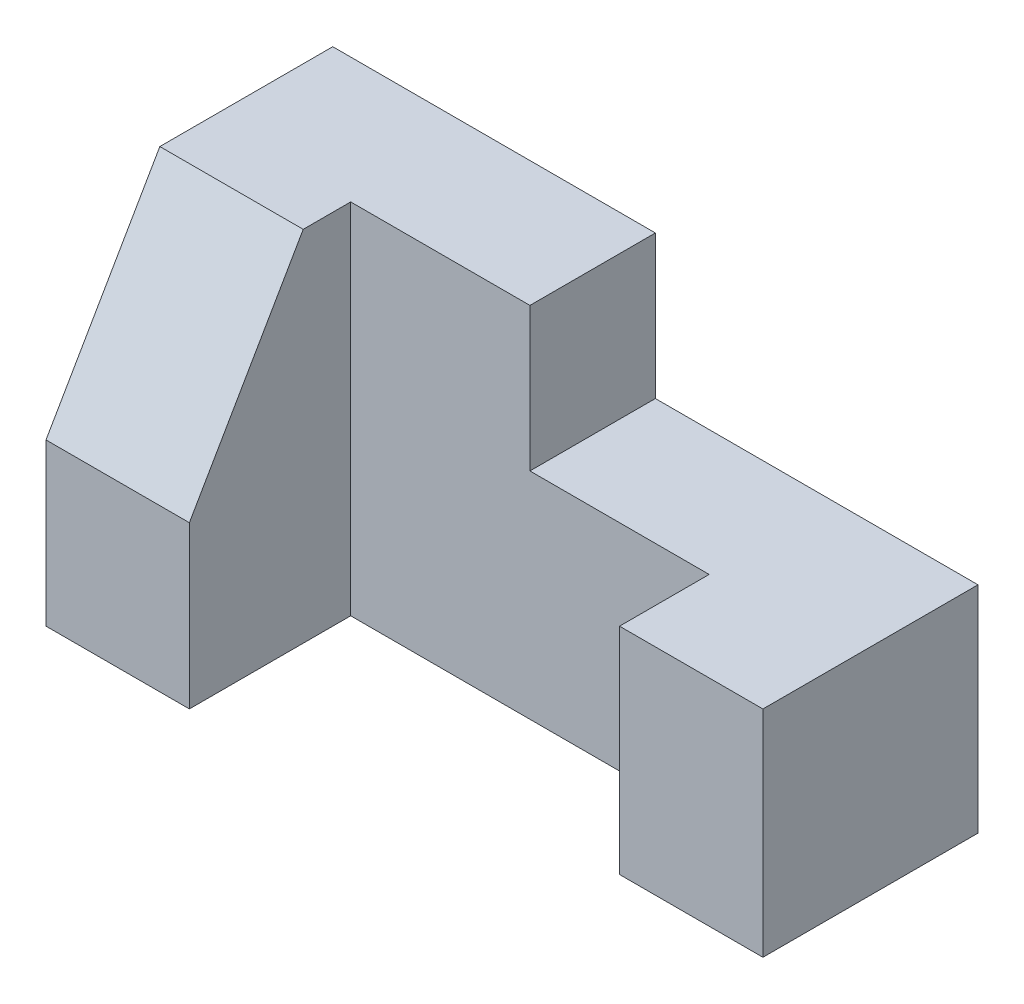
ISO-10303-21;
HEADER;
FILE_DESCRIPTION(('STEP AP214'),'2;1');
FILE_NAME('part.step','',(''),(''),'','','');
FILE_SCHEMA(('AUTOMOTIVE_DESIGN { 1 0 10303 214 1 1 1 1 }'));
ENDSEC;
DATA;
#1=APPLICATION_CONTEXT('core data for automotive mechanical design processes');
#2=APPLICATION_PROTOCOL_DEFINITION('international standard','automotive_design',2000,#1);
#3=PRODUCT_CONTEXT('',#1,'mechanical');
#4=PRODUCT('Part','Part','',(#3));
#5=PRODUCT_RELATED_PRODUCT_CATEGORY('part','',(#4));
#6=PRODUCT_DEFINITION_FORMATION('','',#4);
#7=PRODUCT_DEFINITION_CONTEXT('part definition',#1,'design');
#8=PRODUCT_DEFINITION('design','',#6,#7);
#9=PRODUCT_DEFINITION_SHAPE('','',#8);
#10=(LENGTH_UNIT() NAMED_UNIT(*) SI_UNIT(.MILLI.,.METRE.));
#11=(NAMED_UNIT(*) PLANE_ANGLE_UNIT() SI_UNIT($,.RADIAN.));
#12=(NAMED_UNIT(*) SI_UNIT($,.STERADIAN.) SOLID_ANGLE_UNIT());
#13=UNCERTAINTY_MEASURE_WITH_UNIT(LENGTH_MEASURE(1.E-05),#10,'distance_accuracy_value','');
#14=(GEOMETRIC_REPRESENTATION_CONTEXT(3) GLOBAL_UNCERTAINTY_ASSIGNED_CONTEXT((#13)) GLOBAL_UNIT_ASSIGNED_CONTEXT((#10,
#11,#12)) REPRESENTATION_CONTEXT('',''));
#15=CARTESIAN_POINT('',(0.,0.,0.));
#16=DIRECTION('',(0.,0.,1.));
#17=DIRECTION('',(1.,0.,0.));
#18=AXIS2_PLACEMENT_3D('',#15,#16,#17);
#19=CARTESIAN_POINT('',(0.,38.1,22.225));
#20=DIRECTION('',(0.,-1.,0.));
#21=DIRECTION('',(1.,0.,0.));
#22=AXIS2_PLACEMENT_3D('',#19,#20,#21);
#23=PLANE('',#22);
#24=DIRECTION('',(-1.,0.,0.));
#25=VECTOR('',#24,1.);
#26=CARTESIAN_POINT('',(0.,38.1,0.));
#27=LINE('',#26,#25);
#28=CARTESIAN_POINT('',(114.3,38.1,0.));
#29=VERTEX_POINT('',#28);
#30=CARTESIAN_POINT('',(57.15,38.1,0.));
#31=VERTEX_POINT('',#30);
#32=EDGE_CURVE('E198',#29,#31,#27,.T.);
#33=ORIENTED_EDGE('',*,*,#32,.T.);
#34=DIRECTION('',(0.,0.,-1.));
#35=VECTOR('',#34,1.);
#36=CARTESIAN_POINT('',(57.15,38.1,22.225));
#37=LINE('',#36,#35);
#38=CARTESIAN_POINT('',(57.15,38.1,22.225));
#39=VERTEX_POINT('',#38);
#40=EDGE_CURVE('E11',#39,#31,#37,.T.);
#41=ORIENTED_EDGE('',*,*,#40,.F.);
#42=DIRECTION('',(-1.,0.,0.));
#43=VECTOR('',#42,1.);
#44=CARTESIAN_POINT('',(0.,38.1,22.225));
#45=LINE('',#44,#43);
#46=CARTESIAN_POINT('',(88.9,38.1,22.225));
#47=VERTEX_POINT('',#46);
#48=EDGE_CURVE('E93',#47,#39,#45,.T.);
#49=ORIENTED_EDGE('',*,*,#48,.F.);
#50=DIRECTION('',(0.,0.,-1.));
#51=VECTOR('',#50,1.);
#52=CARTESIAN_POINT('',(88.9,38.1,38.1));
#53=LINE('',#52,#51);
#54=CARTESIAN_POINT('',(88.9,38.1,38.1));
#55=VERTEX_POINT('',#54);
#56=EDGE_CURVE('E194',#55,#47,#53,.T.);
#57=ORIENTED_EDGE('',*,*,#56,.F.);
#58=DIRECTION('',(-1.,0.,0.));
#59=VECTOR('',#58,1.);
#60=CARTESIAN_POINT('',(0.,38.1,38.1));
#61=LINE('',#60,#59);
#62=CARTESIAN_POINT('',(114.3,38.1,38.1));
#63=VERTEX_POINT('',#62);
#64=EDGE_CURVE('E164',#63,#55,#61,.T.);
#65=ORIENTED_EDGE('',*,*,#64,.F.);
#66=DIRECTION('',(0.,0.,-1.));
#67=VECTOR('',#66,1.);
#68=CARTESIAN_POINT('',(114.3,38.1,38.1));
#69=LINE('',#68,#67);
#70=EDGE_CURVE('E181',#63,#29,#69,.T.);
#71=ORIENTED_EDGE('',*,*,#70,.T.);
#72=EDGE_LOOP('',(#33,#41,#49,#57,#65,#71));
#73=FACE_BOUND('',#72,.T.);
#74=ADVANCED_FACE('F45',(#73),#23,.F.);
#75=CARTESIAN_POINT('',(57.15,0.,22.225));
#76=DIRECTION('',(-1.,0.,0.));
#77=DIRECTION('',(0.,0.,1.));
#78=AXIS2_PLACEMENT_3D('',#75,#76,#77);
#79=PLANE('',#78);
#80=DIRECTION('',(0.,1.,0.));
#81=VECTOR('',#80,1.);
#82=CARTESIAN_POINT('',(57.15,0.,0.));
#83=LINE('',#82,#81);
#84=CARTESIAN_POINT('',(57.15,63.5,0.));
#85=VERTEX_POINT('',#84);
#86=EDGE_CURVE('E85',#31,#85,#83,.T.);
#87=ORIENTED_EDGE('',*,*,#86,.T.);
#88=DIRECTION('',(0.,0.,-1.));
#89=VECTOR('',#88,1.);
#90=CARTESIAN_POINT('',(57.15,63.5,22.225));
#91=LINE('',#90,#89);
#92=CARTESIAN_POINT('',(57.15,63.5,22.225));
#93=VERTEX_POINT('',#92);
#94=EDGE_CURVE('E53',#93,#85,#91,.T.);
#95=ORIENTED_EDGE('',*,*,#94,.F.);
#96=DIRECTION('',(0.,1.,0.));
#97=VECTOR('',#96,1.);
#98=CARTESIAN_POINT('',(57.15,0.,22.225));
#99=LINE('',#98,#97);
#100=EDGE_CURVE('E206',#39,#93,#99,.T.);
#101=ORIENTED_EDGE('',*,*,#100,.F.);
#102=ORIENTED_EDGE('',*,*,#40,.T.);
#103=EDGE_LOOP('',(#87,#95,#101,#102));
#104=FACE_BOUND('',#103,.T.);
#105=ADVANCED_FACE('F278',(#104),#79,.F.);
#106=CARTESIAN_POINT('',(0.,63.5,22.225));
#107=DIRECTION('',(0.,-1.,0.));
#108=DIRECTION('',(1.,0.,0.));
#109=AXIS2_PLACEMENT_3D('',#106,#107,#108);
#110=PLANE('',#109);
#111=DIRECTION('',(0.,0.,-1.));
#112=VECTOR('',#111,1.);
#113=CARTESIAN_POINT('',(0.,63.5,50.8));
#114=LINE('',#113,#112);
#115=CARTESIAN_POINT('',(0.,63.5,30.6360418485526));
#116=VERTEX_POINT('',#115);
#117=CARTESIAN_POINT('',(0.,63.5,0.));
#118=VERTEX_POINT('',#117);
#119=EDGE_CURVE('E152',#116,#118,#114,.T.);
#120=ORIENTED_EDGE('',*,*,#119,.F.);
#121=DIRECTION('',(-1.,0.,0.));
#122=VECTOR('',#121,1.);
#123=CARTESIAN_POINT('',(25.4,63.5,30.6360418485526));
#124=LINE('',#123,#122);
#125=CARTESIAN_POINT('',(25.4,63.5,30.6360418485526));
#126=VERTEX_POINT('',#125);
#127=EDGE_CURVE('E140',#126,#116,#124,.T.);
#128=ORIENTED_EDGE('',*,*,#127,.F.);
#129=DIRECTION('',(0.,0.,-1.));
#130=VECTOR('',#129,1.);
#131=CARTESIAN_POINT('',(25.4,63.5,50.8));
#132=LINE('',#131,#130);
#133=CARTESIAN_POINT('',(25.4,63.5,22.225));
#134=VERTEX_POINT('',#133);
#135=EDGE_CURVE('E150',#126,#134,#132,.T.);
#136=ORIENTED_EDGE('',*,*,#135,.T.);
#137=DIRECTION('',(-1.,0.,0.));
#138=VECTOR('',#137,1.);
#139=CARTESIAN_POINT('',(0.,63.5,22.225));
#140=LINE('',#139,#138);
#141=EDGE_CURVE('E209',#93,#134,#140,.T.);
#142=ORIENTED_EDGE('',*,*,#141,.F.);
#143=ORIENTED_EDGE('',*,*,#94,.T.);
#144=DIRECTION('',(-1.,0.,0.));
#145=VECTOR('',#144,1.);
#146=CARTESIAN_POINT('',(0.,63.5,0.));
#147=LINE('',#146,#145);
#148=EDGE_CURVE('E221',#85,#118,#147,.T.);
#149=ORIENTED_EDGE('',*,*,#148,.T.);
#150=EDGE_LOOP('',(#120,#128,#136,#142,#143,#149));
#151=FACE_BOUND('',#150,.T.);
#152=ADVANCED_FACE('F148',(#151),#110,.F.);
#153=CARTESIAN_POINT('',(0.,0.,22.225));
#154=DIRECTION('',(0.,1.,0.));
#155=DIRECTION('',(0.,0.,1.));
#156=AXIS2_PLACEMENT_3D('',#153,#154,#155);
#157=PLANE('',#156);
#158=DIRECTION('',(1.,0.,0.));
#159=VECTOR('',#158,1.);
#160=CARTESIAN_POINT('',(0.,0.,0.));
#161=LINE('',#160,#159);
#162=CARTESIAN_POINT('',(0.,0.,0.));
#163=VERTEX_POINT('',#162);
#164=CARTESIAN_POINT('',(114.3,0.,0.));
#165=VERTEX_POINT('',#164);
#166=EDGE_CURVE('E203',#163,#165,#161,.T.);
#167=ORIENTED_EDGE('',*,*,#166,.T.);
#168=DIRECTION('',(0.,0.,-1.));
#169=VECTOR('',#168,1.);
#170=CARTESIAN_POINT('',(114.3,0.,38.1));
#171=LINE('',#170,#169);
#172=CARTESIAN_POINT('',(114.3,0.,38.1));
#173=VERTEX_POINT('',#172);
#174=EDGE_CURVE('E186',#173,#165,#171,.T.);
#175=ORIENTED_EDGE('',*,*,#174,.F.);
#176=DIRECTION('',(1.,0.,0.));
#177=VECTOR('',#176,1.);
#178=CARTESIAN_POINT('',(0.,0.,38.1));
#179=LINE('',#178,#177);
#180=CARTESIAN_POINT('',(88.9,0.,38.1));
#181=VERTEX_POINT('',#180);
#182=EDGE_CURVE('E176',#181,#173,#179,.T.);
#183=ORIENTED_EDGE('',*,*,#182,.F.);
#184=DIRECTION('',(0.,0.,-1.));
#185=VECTOR('',#184,1.);
#186=CARTESIAN_POINT('',(88.9,0.,38.1));
#187=LINE('',#186,#185);
#188=CARTESIAN_POINT('',(88.9,0.,22.225));
#189=VERTEX_POINT('',#188);
#190=EDGE_CURVE('E190',#181,#189,#187,.T.);
#191=ORIENTED_EDGE('',*,*,#190,.T.);
#192=DIRECTION('',(1.,0.,0.));
#193=VECTOR('',#192,1.);
#194=CARTESIAN_POINT('',(0.,0.,22.225));
#195=LINE('',#194,#193);
#196=CARTESIAN_POINT('',(25.4,0.,22.225));
#197=VERTEX_POINT('',#196);
#198=EDGE_CURVE('E214',#197,#189,#195,.T.);
#199=ORIENTED_EDGE('',*,*,#198,.F.);
#200=DIRECTION('',(0.,0.,-1.));
#201=VECTOR('',#200,1.);
#202=CARTESIAN_POINT('',(25.4,0.,50.8));
#203=LINE('',#202,#201);
#204=CARTESIAN_POINT('',(25.4,0.,50.8));
#205=VERTEX_POINT('',#204);
#206=EDGE_CURVE('E69',#205,#197,#203,.T.);
#207=ORIENTED_EDGE('',*,*,#206,.F.);
#208=DIRECTION('',(1.,0.,0.));
#209=VECTOR('',#208,1.);
#210=CARTESIAN_POINT('',(0.,0.,50.8));
#211=LINE('',#210,#209);
#212=CARTESIAN_POINT('',(0.,0.,50.8));
#213=VERTEX_POINT('',#212);
#214=EDGE_CURVE('E247',#213,#205,#211,.T.);
#215=ORIENTED_EDGE('',*,*,#214,.F.);
#216=DIRECTION('',(0.,0.,-1.));
#217=VECTOR('',#216,1.);
#218=CARTESIAN_POINT('',(0.,0.,50.8));
#219=LINE('',#218,#217);
#220=EDGE_CURVE('E166',#213,#163,#219,.T.);
#221=ORIENTED_EDGE('',*,*,#220,.T.);
#222=EDGE_LOOP('',(#167,#175,#183,#191,#199,#207,#215,#221));
#223=FACE_BOUND('',#222,.T.);
#224=ADVANCED_FACE('F253',(#223),#157,.F.);
#225=CARTESIAN_POINT('',(0.,0.,22.225));
#226=DIRECTION('',(0.,0.,1.));
#227=DIRECTION('',(1.,0.,0.));
#228=AXIS2_PLACEMENT_3D('',#225,#226,#227);
#229=PLANE('',#228);
#230=DIRECTION('',(0.,-1.,0.));
#231=VECTOR('',#230,1.);
#232=CARTESIAN_POINT('',(88.9,0.,22.225));
#233=LINE('',#232,#231);
#234=EDGE_CURVE('E199',#47,#189,#233,.T.);
#235=ORIENTED_EDGE('',*,*,#234,.F.);
#236=ORIENTED_EDGE('',*,*,#48,.T.);
#237=ORIENTED_EDGE('',*,*,#100,.T.);
#238=ORIENTED_EDGE('',*,*,#141,.T.);
#239=DIRECTION('',(0.,-1.,0.));
#240=VECTOR('',#239,1.);
#241=CARTESIAN_POINT('',(25.4,0.,22.225));
#242=LINE('',#241,#240);
#243=EDGE_CURVE('E156',#134,#197,#242,.T.);
#244=ORIENTED_EDGE('',*,*,#243,.T.);
#245=ORIENTED_EDGE('',*,*,#198,.T.);
#246=EDGE_LOOP('',(#235,#236,#237,#238,#244,#245));
#247=FACE_BOUND('',#246,.T.);
#248=ADVANCED_FACE('F268',(#247),#229,.T.);
#249=CARTESIAN_POINT('',(0.,0.,0.));
#250=DIRECTION('',(0.,0.,1.));
#251=DIRECTION('',(1.,0.,0.));
#252=AXIS2_PLACEMENT_3D('',#249,#250,#251);
#253=PLANE('',#252);
#254=ORIENTED_EDGE('',*,*,#32,.F.);
#255=DIRECTION('',(0.,1.,0.));
#256=VECTOR('',#255,1.);
#257=CARTESIAN_POINT('',(114.3,0.,0.));
#258=LINE('',#257,#256);
#259=EDGE_CURVE('E159',#165,#29,#258,.T.);
#260=ORIENTED_EDGE('',*,*,#259,.F.);
#261=ORIENTED_EDGE('',*,*,#166,.F.);
#262=DIRECTION('',(0.,-1.,0.));
#263=VECTOR('',#262,1.);
#264=CARTESIAN_POINT('',(0.,0.,0.));
#265=LINE('',#264,#263);
#266=EDGE_CURVE('E232',#118,#163,#265,.T.);
#267=ORIENTED_EDGE('',*,*,#266,.F.);
#268=ORIENTED_EDGE('',*,*,#148,.F.);
#269=ORIENTED_EDGE('',*,*,#86,.F.);
#270=EDGE_LOOP('',(#254,#260,#261,#267,#268,#269));
#271=FACE_BOUND('',#270,.T.);
#272=ADVANCED_FACE('F230',(#271),#253,.F.);
#273=CARTESIAN_POINT('',(88.9,0.,38.1));
#274=DIRECTION('',(1.,0.,0.));
#275=DIRECTION('',(0.,0.,-1.));
#276=AXIS2_PLACEMENT_3D('',#273,#274,#275);
#277=PLANE('',#276);
#278=ORIENTED_EDGE('',*,*,#56,.T.);
#279=ORIENTED_EDGE('',*,*,#234,.T.);
#280=ORIENTED_EDGE('',*,*,#190,.F.);
#281=DIRECTION('',(0.,-1.,0.));
#282=VECTOR('',#281,1.);
#283=CARTESIAN_POINT('',(88.9,0.,38.1));
#284=LINE('',#283,#282);
#285=EDGE_CURVE('E173',#55,#181,#284,.T.);
#286=ORIENTED_EDGE('',*,*,#285,.F.);
#287=EDGE_LOOP('',(#278,#279,#280,#286));
#288=FACE_BOUND('',#287,.T.);
#289=ADVANCED_FACE('F270',(#288),#277,.F.);
#290=CARTESIAN_POINT('',(114.3,0.,38.1));
#291=DIRECTION('',(-1.,0.,0.));
#292=DIRECTION('',(0.,-1.,0.));
#293=AXIS2_PLACEMENT_3D('',#290,#291,#292);
#294=PLANE('',#293);
#295=ORIENTED_EDGE('',*,*,#259,.T.);
#296=ORIENTED_EDGE('',*,*,#70,.F.);
#297=DIRECTION('',(0.,1.,0.));
#298=VECTOR('',#297,1.);
#299=CARTESIAN_POINT('',(114.3,0.,38.1));
#300=LINE('',#299,#298);
#301=EDGE_CURVE('E179',#173,#63,#300,.T.);
#302=ORIENTED_EDGE('',*,*,#301,.F.);
#303=ORIENTED_EDGE('',*,*,#174,.T.);
#304=EDGE_LOOP('',(#295,#296,#302,#303));
#305=FACE_BOUND('',#304,.T.);
#306=ADVANCED_FACE('F277',(#305),#294,.F.);
#307=CARTESIAN_POINT('',(0.,0.,38.1));
#308=DIRECTION('',(0.,0.,1.));
#309=DIRECTION('',(1.,0.,0.));
#310=AXIS2_PLACEMENT_3D('',#307,#308,#309);
#311=PLANE('',#310);
#312=ORIENTED_EDGE('',*,*,#64,.T.);
#313=ORIENTED_EDGE('',*,*,#285,.T.);
#314=ORIENTED_EDGE('',*,*,#182,.T.);
#315=ORIENTED_EDGE('',*,*,#301,.T.);
#316=EDGE_LOOP('',(#312,#313,#314,#315));
#317=FACE_BOUND('',#316,.T.);
#318=ADVANCED_FACE('F274',(#317),#311,.T.);
#319=CARTESIAN_POINT('',(25.4,0.,50.8));
#320=DIRECTION('',(1.,0.,0.));
#321=DIRECTION('',(0.,1.,0.));
#322=AXIS2_PLACEMENT_3D('',#319,#320,#321);
#323=PLANE('',#322);
#324=DIRECTION('',(0.,-0.866025403784442,0.499999999999995));
#325=VECTOR('',#324,1.);
#326=CARTESIAN_POINT('',(25.4,28.575,50.8));
#327=LINE('',#326,#325);
#328=CARTESIAN_POINT('',(25.4,28.575,50.8));
#329=VERTEX_POINT('',#328);
#330=EDGE_CURVE('E137',#126,#329,#327,.T.);
#331=ORIENTED_EDGE('',*,*,#330,.T.);
#332=DIRECTION('',(0.,-1.,0.));
#333=VECTOR('',#332,1.);
#334=CARTESIAN_POINT('',(25.4,0.,50.8));
#335=LINE('',#334,#333);
#336=EDGE_CURVE('E238',#329,#205,#335,.T.);
#337=ORIENTED_EDGE('',*,*,#336,.T.);
#338=ORIENTED_EDGE('',*,*,#206,.T.);
#339=ORIENTED_EDGE('',*,*,#243,.F.);
#340=ORIENTED_EDGE('',*,*,#135,.F.);
#341=EDGE_LOOP('',(#331,#337,#338,#339,#340));
#342=FACE_BOUND('',#341,.T.);
#343=ADVANCED_FACE('F155',(#342),#323,.T.);
#344=CARTESIAN_POINT('',(0.,0.,50.8));
#345=DIRECTION('',(1.,0.,0.));
#346=DIRECTION('',(0.,1.,0.));
#347=AXIS2_PLACEMENT_3D('',#344,#345,#346);
#348=PLANE('',#347);
#349=DIRECTION('',(0.,-1.,0.));
#350=VECTOR('',#349,1.);
#351=CARTESIAN_POINT('',(0.,0.,50.8));
#352=LINE('',#351,#350);
#353=CARTESIAN_POINT('',(0.,28.575,50.8));
#354=VERTEX_POINT('',#353);
#355=EDGE_CURVE('E242',#354,#213,#352,.T.);
#356=ORIENTED_EDGE('',*,*,#355,.F.);
#357=DIRECTION('',(0.,-0.866025403784442,0.499999999999995));
#358=VECTOR('',#357,1.);
#359=CARTESIAN_POINT('',(0.,28.575,50.8));
#360=LINE('',#359,#358);
#361=EDGE_CURVE('E60',#116,#354,#360,.T.);
#362=ORIENTED_EDGE('',*,*,#361,.F.);
#363=ORIENTED_EDGE('',*,*,#119,.T.);
#364=ORIENTED_EDGE('',*,*,#266,.T.);
#365=ORIENTED_EDGE('',*,*,#220,.F.);
#366=EDGE_LOOP('',(#356,#362,#363,#364,#365));
#367=FACE_BOUND('',#366,.T.);
#368=ADVANCED_FACE('F257',(#367),#348,.F.);
#369=CARTESIAN_POINT('',(0.,0.,50.8));
#370=DIRECTION('',(0.,0.,1.));
#371=DIRECTION('',(1.,0.,0.));
#372=AXIS2_PLACEMENT_3D('',#369,#370,#371);
#373=PLANE('',#372);
#374=DIRECTION('',(-1.,0.,0.));
#375=VECTOR('',#374,1.);
#376=CARTESIAN_POINT('',(25.4,28.575,50.8));
#377=LINE('',#376,#375);
#378=EDGE_CURVE('E141',#329,#354,#377,.T.);
#379=ORIENTED_EDGE('',*,*,#378,.T.);
#380=ORIENTED_EDGE('',*,*,#355,.T.);
#381=ORIENTED_EDGE('',*,*,#214,.T.);
#382=ORIENTED_EDGE('',*,*,#336,.F.);
#383=EDGE_LOOP('',(#379,#380,#381,#382));
#384=FACE_BOUND('',#383,.T.);
#385=ADVANCED_FACE('F263',(#384),#373,.T.);
#386=CARTESIAN_POINT('',(25.4,28.575,50.8));
#387=DIRECTION('',(0.,-0.499999999999995,-0.866025403784441));
#388=DIRECTION('',(0.,0.866025403784442,-0.499999999999995));
#389=AXIS2_PLACEMENT_3D('',#386,#387,#388);
#390=PLANE('',#389);
#391=ORIENTED_EDGE('',*,*,#361,.T.);
#392=ORIENTED_EDGE('',*,*,#378,.F.);
#393=ORIENTED_EDGE('',*,*,#330,.F.);
#394=ORIENTED_EDGE('',*,*,#127,.T.);
#395=EDGE_LOOP('',(#391,#392,#393,#394));
#396=FACE_BOUND('',#395,.T.);
#397=ADVANCED_FACE('F139',(#396),#390,.F.);
#398=CLOSED_SHELL('',(#74,#105,#152,#224,#248,#272,#289,#306,#318,#343,#368,#385,#397));
#399=MANIFOLD_SOLID_BREP('B2',#398);
#400=ADVANCED_BREP_SHAPE_REPRESENTATION('',(#18,#399),#14);
#401=SHAPE_DEFINITION_REPRESENTATION(#9,#400);
ENDSEC;
END-ISO-10303-21;
